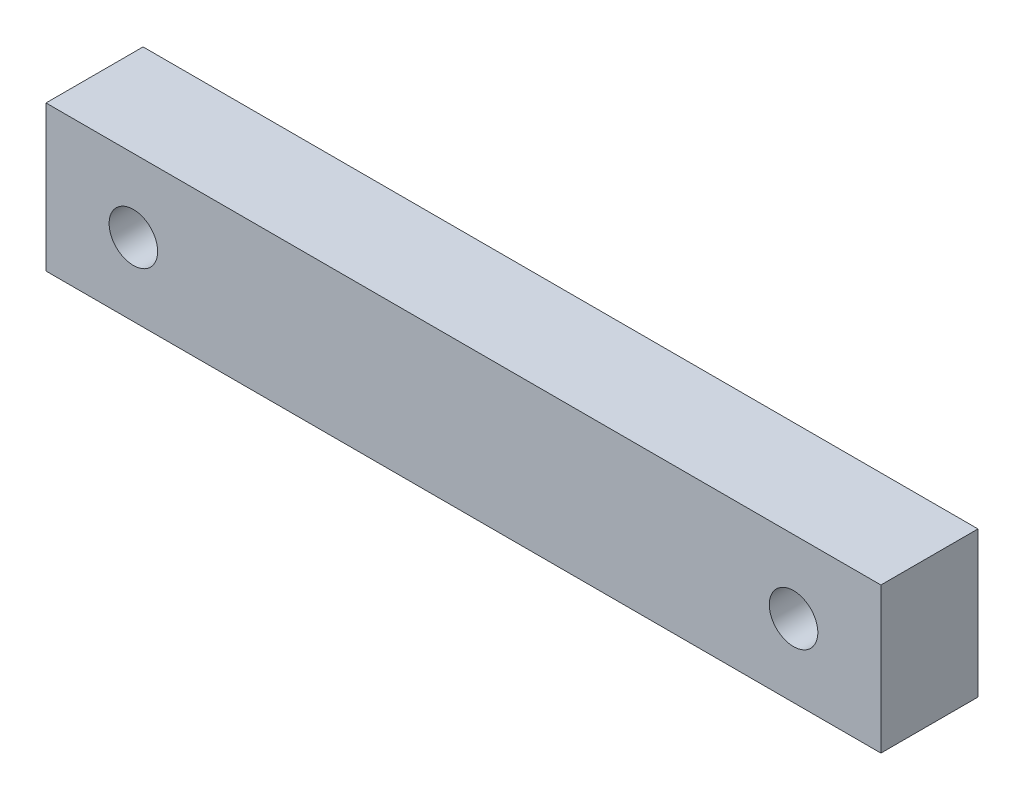
ISO-10303-21;
HEADER;
FILE_DESCRIPTION(('STEP AP214'),'2;1');
FILE_NAME('part.step','',(''),(''),'','','');
FILE_SCHEMA(('AUTOMOTIVE_DESIGN { 1 0 10303 214 1 1 1 1 }'));
ENDSEC;
DATA;
#1=APPLICATION_CONTEXT('core data for automotive mechanical design processes');
#2=APPLICATION_PROTOCOL_DEFINITION('international standard','automotive_design',2000,#1);
#3=PRODUCT_CONTEXT('',#1,'mechanical');
#4=PRODUCT('Part','Part','',(#3));
#5=PRODUCT_RELATED_PRODUCT_CATEGORY('part','',(#4));
#6=PRODUCT_DEFINITION_FORMATION('','',#4);
#7=PRODUCT_DEFINITION_CONTEXT('part definition',#1,'design');
#8=PRODUCT_DEFINITION('design','',#6,#7);
#9=PRODUCT_DEFINITION_SHAPE('','',#8);
#10=(LENGTH_UNIT() NAMED_UNIT(*) SI_UNIT(.MILLI.,.METRE.));
#11=(NAMED_UNIT(*) PLANE_ANGLE_UNIT() SI_UNIT($,.RADIAN.));
#12=(NAMED_UNIT(*) SI_UNIT($,.STERADIAN.) SOLID_ANGLE_UNIT());
#13=UNCERTAINTY_MEASURE_WITH_UNIT(LENGTH_MEASURE(1.E-05),#10,'distance_accuracy_value','');
#14=(GEOMETRIC_REPRESENTATION_CONTEXT(3) GLOBAL_UNCERTAINTY_ASSIGNED_CONTEXT((#13)) GLOBAL_UNIT_ASSIGNED_CONTEXT((#10,
#11,#12)) REPRESENTATION_CONTEXT('',''));
#15=CARTESIAN_POINT('',(0.,0.,0.));
#16=DIRECTION('',(0.,0.,1.));
#17=DIRECTION('',(1.,0.,0.));
#18=AXIS2_PLACEMENT_3D('',#15,#16,#17);
#19=CARTESIAN_POINT('',(0.,0.,10.));
#20=DIRECTION('',(0.,0.,1.));
#21=DIRECTION('',(1.,0.,0.));
#22=AXIS2_PLACEMENT_3D('',#19,#20,#21);
#23=PLANE('',#22);
#24=CARTESIAN_POINT('',(8.99999999999999,7.5,10.));
#25=DIRECTION('',(0.,0.,1.));
#26=DIRECTION('',(1.,0.,0.));
#27=AXIS2_PLACEMENT_3D('',#24,#25,#26);
#28=CIRCLE('',#27,2.5);
#29=CARTESIAN_POINT('',(11.5,7.5,10.));
#30=VERTEX_POINT('',#29);
#31=EDGE_CURVE('E118',#30,#30,#28,.T.);
#32=ORIENTED_EDGE('',*,*,#31,.F.);
#33=EDGE_LOOP('',(#32));
#34=FACE_BOUND('',#33,.T.);
#35=DIRECTION('',(0.,-1.,0.));
#36=VECTOR('',#35,1.);
#37=CARTESIAN_POINT('',(0.,15.,10.));
#38=LINE('',#37,#36);
#39=CARTESIAN_POINT('',(0.,15.,10.));
#40=VERTEX_POINT('',#39);
#41=CARTESIAN_POINT('',(0.,0.,10.));
#42=VERTEX_POINT('',#41);
#43=EDGE_CURVE('E98',#40,#42,#38,.T.);
#44=ORIENTED_EDGE('',*,*,#43,.T.);
#45=DIRECTION('',(1.,0.,0.));
#46=VECTOR('',#45,1.);
#47=CARTESIAN_POINT('',(0.,0.,10.));
#48=LINE('',#47,#46);
#49=CARTESIAN_POINT('',(86.,0.,10.));
#50=VERTEX_POINT('',#49);
#51=EDGE_CURVE('E93',#42,#50,#48,.T.);
#52=ORIENTED_EDGE('',*,*,#51,.T.);
#53=DIRECTION('',(0.,1.,0.));
#54=VECTOR('',#53,1.);
#55=CARTESIAN_POINT('',(86.,0.,10.));
#56=LINE('',#55,#54);
#57=CARTESIAN_POINT('',(86.,15.,10.));
#58=VERTEX_POINT('',#57);
#59=EDGE_CURVE('E96',#50,#58,#56,.T.);
#60=ORIENTED_EDGE('',*,*,#59,.T.);
#61=DIRECTION('',(-1.,0.,0.));
#62=VECTOR('',#61,1.);
#63=CARTESIAN_POINT('',(86.,15.,10.));
#64=LINE('',#63,#62);
#65=EDGE_CURVE('E63',#58,#40,#64,.T.);
#66=ORIENTED_EDGE('',*,*,#65,.T.);
#67=EDGE_LOOP('',(#44,#52,#60,#66));
#68=FACE_BOUND('',#67,.T.);
#69=CARTESIAN_POINT('',(77.,7.50000000000001,10.));
#70=DIRECTION('',(0.,0.,1.));
#71=DIRECTION('',(-1.,0.,0.));
#72=AXIS2_PLACEMENT_3D('',#69,#70,#71);
#73=CIRCLE('',#72,2.50000000000001);
#74=CARTESIAN_POINT('',(74.5,7.50000000000001,10.));
#75=VERTEX_POINT('',#74);
#76=EDGE_CURVE('E140',#75,#75,#73,.T.);
#77=ORIENTED_EDGE('',*,*,#76,.F.);
#78=EDGE_LOOP('',(#77));
#79=FACE_BOUND('',#78,.T.);
#80=ADVANCED_FACE('F45',(#34,#68,#79),#23,.T.);
#81=CARTESIAN_POINT('',(0.,0.,0.));
#82=DIRECTION('',(0.,0.,1.));
#83=DIRECTION('',(1.,0.,0.));
#84=AXIS2_PLACEMENT_3D('',#81,#82,#83);
#85=PLANE('',#84);
#86=DIRECTION('',(0.,-1.,0.));
#87=VECTOR('',#86,1.);
#88=CARTESIAN_POINT('',(0.,15.,0.));
#89=LINE('',#88,#87);
#90=CARTESIAN_POINT('',(0.,15.,0.));
#91=VERTEX_POINT('',#90);
#92=CARTESIAN_POINT('',(0.,0.,0.));
#93=VERTEX_POINT('',#92);
#94=EDGE_CURVE('E114',#91,#93,#89,.T.);
#95=ORIENTED_EDGE('',*,*,#94,.F.);
#96=DIRECTION('',(-1.,0.,0.));
#97=VECTOR('',#96,1.);
#98=CARTESIAN_POINT('',(86.,15.,0.));
#99=LINE('',#98,#97);
#100=CARTESIAN_POINT('',(86.,15.,0.));
#101=VERTEX_POINT('',#100);
#102=EDGE_CURVE('E86',#101,#91,#99,.T.);
#103=ORIENTED_EDGE('',*,*,#102,.F.);
#104=DIRECTION('',(0.,1.,0.));
#105=VECTOR('',#104,1.);
#106=CARTESIAN_POINT('',(86.,0.,0.));
#107=LINE('',#106,#105);
#108=CARTESIAN_POINT('',(86.,0.,0.));
#109=VERTEX_POINT('',#108);
#110=EDGE_CURVE('E80',#109,#101,#107,.T.);
#111=ORIENTED_EDGE('',*,*,#110,.F.);
#112=DIRECTION('',(1.,0.,0.));
#113=VECTOR('',#112,1.);
#114=CARTESIAN_POINT('',(0.,0.,0.));
#115=LINE('',#114,#113);
#116=EDGE_CURVE('E103',#93,#109,#115,.T.);
#117=ORIENTED_EDGE('',*,*,#116,.F.);
#118=EDGE_LOOP('',(#95,#103,#111,#117));
#119=FACE_BOUND('',#118,.T.);
#120=CARTESIAN_POINT('',(8.99999999999999,7.5,0.));
#121=DIRECTION('',(0.,0.,1.));
#122=DIRECTION('',(1.,0.,0.));
#123=AXIS2_PLACEMENT_3D('',#120,#121,#122);
#124=CIRCLE('',#123,2.5);
#125=CARTESIAN_POINT('',(11.5,7.5,0.));
#126=VERTEX_POINT('',#125);
#127=EDGE_CURVE('E136',#126,#126,#124,.T.);
#128=ORIENTED_EDGE('',*,*,#127,.T.);
#129=EDGE_LOOP('',(#128));
#130=FACE_BOUND('',#129,.T.);
#131=CARTESIAN_POINT('',(77.,7.50000000000001,0.));
#132=DIRECTION('',(0.,0.,1.));
#133=DIRECTION('',(-1.,0.,0.));
#134=AXIS2_PLACEMENT_3D('',#131,#132,#133);
#135=CIRCLE('',#134,2.50000000000001);
#136=CARTESIAN_POINT('',(74.5,7.50000000000001,0.));
#137=VERTEX_POINT('',#136);
#138=EDGE_CURVE('E144',#137,#137,#135,.T.);
#139=ORIENTED_EDGE('',*,*,#138,.T.);
#140=EDGE_LOOP('',(#139));
#141=FACE_BOUND('',#140,.T.);
#142=ADVANCED_FACE('F131',(#119,#130,#141),#85,.F.);
#143=CARTESIAN_POINT('',(0.,15.,10.));
#144=DIRECTION('',(1.,0.,0.));
#145=DIRECTION('',(0.,0.,-1.));
#146=AXIS2_PLACEMENT_3D('',#143,#144,#145);
#147=PLANE('',#146);
#148=ORIENTED_EDGE('',*,*,#94,.T.);
#149=DIRECTION('',(0.,0.,-1.));
#150=VECTOR('',#149,1.);
#151=CARTESIAN_POINT('',(0.,0.,10.));
#152=LINE('',#151,#150);
#153=EDGE_CURVE('E11',#42,#93,#152,.T.);
#154=ORIENTED_EDGE('',*,*,#153,.F.);
#155=ORIENTED_EDGE('',*,*,#43,.F.);
#156=DIRECTION('',(0.,0.,-1.));
#157=VECTOR('',#156,1.);
#158=CARTESIAN_POINT('',(0.,15.,10.));
#159=LINE('',#158,#157);
#160=EDGE_CURVE('E110',#40,#91,#159,.T.);
#161=ORIENTED_EDGE('',*,*,#160,.T.);
#162=EDGE_LOOP('',(#148,#154,#155,#161));
#163=FACE_BOUND('',#162,.T.);
#164=ADVANCED_FACE('F47',(#163),#147,.F.);
#165=CARTESIAN_POINT('',(0.,0.,10.));
#166=DIRECTION('',(0.,1.,0.));
#167=DIRECTION('',(-1.,0.,0.));
#168=AXIS2_PLACEMENT_3D('',#165,#166,#167);
#169=PLANE('',#168);
#170=ORIENTED_EDGE('',*,*,#116,.T.);
#171=DIRECTION('',(0.,0.,-1.));
#172=VECTOR('',#171,1.);
#173=CARTESIAN_POINT('',(86.,0.,10.));
#174=LINE('',#173,#172);
#175=EDGE_CURVE('E55',#50,#109,#174,.T.);
#176=ORIENTED_EDGE('',*,*,#175,.F.);
#177=ORIENTED_EDGE('',*,*,#51,.F.);
#178=ORIENTED_EDGE('',*,*,#153,.T.);
#179=EDGE_LOOP('',(#170,#176,#177,#178));
#180=FACE_BOUND('',#179,.T.);
#181=ADVANCED_FACE('F102',(#180),#169,.F.);
#182=CARTESIAN_POINT('',(86.,0.,10.));
#183=DIRECTION('',(-1.,0.,0.));
#184=DIRECTION('',(0.,0.,1.));
#185=AXIS2_PLACEMENT_3D('',#182,#183,#184);
#186=PLANE('',#185);
#187=ORIENTED_EDGE('',*,*,#110,.T.);
#188=DIRECTION('',(0.,0.,-1.));
#189=VECTOR('',#188,1.);
#190=CARTESIAN_POINT('',(86.,15.,10.));
#191=LINE('',#190,#189);
#192=EDGE_CURVE('E105',#58,#101,#191,.T.);
#193=ORIENTED_EDGE('',*,*,#192,.F.);
#194=ORIENTED_EDGE('',*,*,#59,.F.);
#195=ORIENTED_EDGE('',*,*,#175,.T.);
#196=EDGE_LOOP('',(#187,#193,#194,#195));
#197=FACE_BOUND('',#196,.T.);
#198=ADVANCED_FACE('F106',(#197),#186,.F.);
#199=CARTESIAN_POINT('',(86.,15.,10.));
#200=DIRECTION('',(0.,-1.,0.));
#201=DIRECTION('',(1.,0.,0.));
#202=AXIS2_PLACEMENT_3D('',#199,#200,#201);
#203=PLANE('',#202);
#204=ORIENTED_EDGE('',*,*,#102,.T.);
#205=ORIENTED_EDGE('',*,*,#160,.F.);
#206=ORIENTED_EDGE('',*,*,#65,.F.);
#207=ORIENTED_EDGE('',*,*,#192,.T.);
#208=EDGE_LOOP('',(#204,#205,#206,#207));
#209=FACE_BOUND('',#208,.T.);
#210=ADVANCED_FACE('F128',(#209),#203,.F.);
#211=CARTESIAN_POINT('',(8.99999999999999,7.5,10.));
#212=DIRECTION('',(0.,0.,-1.));
#213=DIRECTION('',(-1.,0.,0.));
#214=AXIS2_PLACEMENT_3D('',#211,#212,#213);
#215=CYLINDRICAL_SURFACE('',#214,2.5);
#216=ORIENTED_EDGE('',*,*,#31,.T.);
#217=EDGE_LOOP('',(#216));
#218=FACE_BOUND('',#217,.T.);
#219=ORIENTED_EDGE('',*,*,#127,.F.);
#220=EDGE_LOOP('',(#219));
#221=FACE_BOUND('',#220,.T.);
#222=ADVANCED_FACE('F163',(#218,#221),#215,.F.);
#223=CARTESIAN_POINT('',(77.,7.50000000000001,10.));
#224=DIRECTION('',(0.,0.,-1.));
#225=DIRECTION('',(-1.,0.,0.));
#226=AXIS2_PLACEMENT_3D('',#223,#224,#225);
#227=CYLINDRICAL_SURFACE('',#226,2.50000000000001);
#228=ORIENTED_EDGE('',*,*,#76,.T.);
#229=EDGE_LOOP('',(#228));
#230=FACE_BOUND('',#229,.T.);
#231=ORIENTED_EDGE('',*,*,#138,.F.);
#232=EDGE_LOOP('',(#231));
#233=FACE_BOUND('',#232,.T.);
#234=ADVANCED_FACE('F152',(#230,#233),#227,.F.);
#235=CLOSED_SHELL('',(#80,#142,#164,#181,#198,#210,#222,#234));
#236=MANIFOLD_SOLID_BREP('B2',#235);
#237=ADVANCED_BREP_SHAPE_REPRESENTATION('',(#18,#236),#14);
#238=SHAPE_DEFINITION_REPRESENTATION(#9,#237);
ENDSEC;
END-ISO-10303-21;
